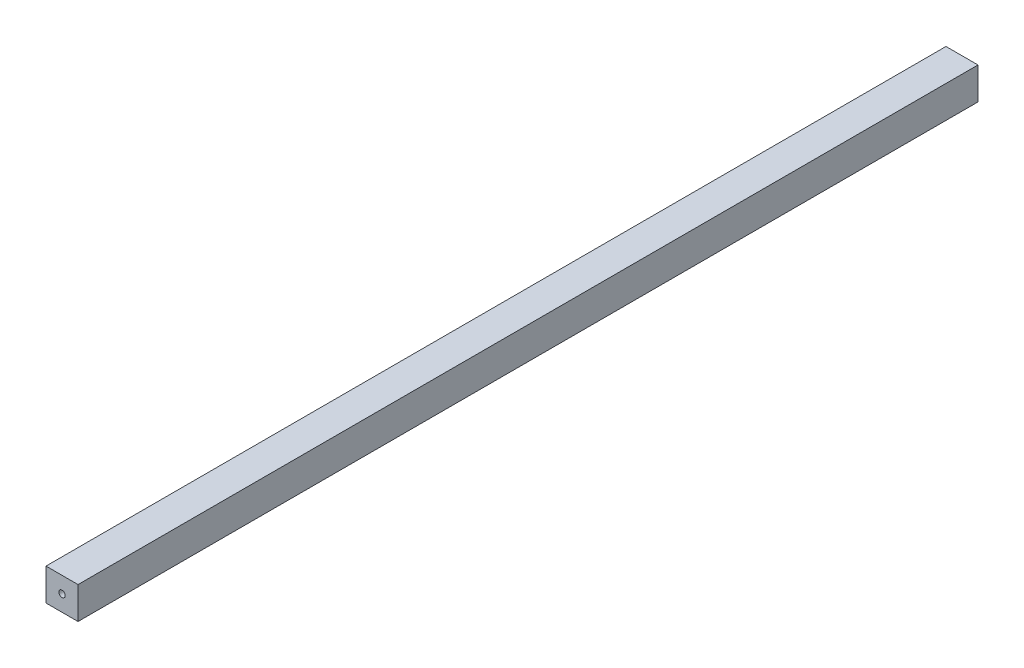
ISO-10303-21;
HEADER;
FILE_DESCRIPTION(('STEP AP214'),'2;1');
FILE_NAME('part.step','',(''),(''),'','','');
FILE_SCHEMA(('AUTOMOTIVE_DESIGN { 1 0 10303 214 1 1 1 1 }'));
ENDSEC;
DATA;
#1=APPLICATION_CONTEXT('core data for automotive mechanical design processes');
#2=APPLICATION_PROTOCOL_DEFINITION('international standard','automotive_design',2000,#1);
#3=PRODUCT_CONTEXT('',#1,'mechanical');
#4=PRODUCT('Part','Part','',(#3));
#5=PRODUCT_RELATED_PRODUCT_CATEGORY('part','',(#4));
#6=PRODUCT_DEFINITION_FORMATION('','',#4);
#7=PRODUCT_DEFINITION_CONTEXT('part definition',#1,'design');
#8=PRODUCT_DEFINITION('design','',#6,#7);
#9=PRODUCT_DEFINITION_SHAPE('','',#8);
#10=(LENGTH_UNIT() NAMED_UNIT(*) SI_UNIT(.MILLI.,.METRE.));
#11=(NAMED_UNIT(*) PLANE_ANGLE_UNIT() SI_UNIT($,.RADIAN.));
#12=(NAMED_UNIT(*) SI_UNIT($,.STERADIAN.) SOLID_ANGLE_UNIT());
#13=UNCERTAINTY_MEASURE_WITH_UNIT(LENGTH_MEASURE(1.E-05),#10,'distance_accuracy_value','');
#14=(GEOMETRIC_REPRESENTATION_CONTEXT(3) GLOBAL_UNCERTAINTY_ASSIGNED_CONTEXT((#13)) GLOBAL_UNIT_ASSIGNED_CONTEXT((#10,
#11,#12)) REPRESENTATION_CONTEXT('',''));
#15=CARTESIAN_POINT('',(0.,0.,0.));
#16=DIRECTION('',(0.,0.,1.));
#17=DIRECTION('',(1.,0.,0.));
#18=AXIS2_PLACEMENT_3D('',#15,#16,#17);
#19=CARTESIAN_POINT('',(0.,0.,562.));
#20=DIRECTION('',(1.,0.,0.));
#21=DIRECTION('',(0.,0.,-1.));
#22=AXIS2_PLACEMENT_3D('',#19,#20,#21);
#23=PLANE('',#22);
#24=CARTESIAN_POINT('',(0.,10.,551.));
#25=DIRECTION('',(-1.,0.,0.));
#26=DIRECTION('',(0.,0.,1.));
#27=AXIS2_PLACEMENT_3D('',#24,#25,#26);
#28=CIRCLE('',#27,1.49999999999999);
#29=CARTESIAN_POINT('',(0.,10.,552.5));
#30=VERTEX_POINT('',#29);
#31=EDGE_CURVE('E142',#30,#30,#28,.T.);
#32=ORIENTED_EDGE('',*,*,#31,.F.);
#33=EDGE_LOOP('',(#32));
#34=FACE_BOUND('',#33,.T.);
#35=CARTESIAN_POINT('',(0.,9.99999999999958,491.));
#36=DIRECTION('',(-1.,0.,0.));
#37=DIRECTION('',(0.,0.,1.));
#38=AXIS2_PLACEMENT_3D('',#35,#36,#37);
#39=CIRCLE('',#38,1.49999999999999);
#40=CARTESIAN_POINT('',(0.,9.99999999999958,492.5));
#41=VERTEX_POINT('',#40);
#42=EDGE_CURVE('E148',#41,#41,#39,.T.);
#43=ORIENTED_EDGE('',*,*,#42,.F.);
#44=EDGE_LOOP('',(#43));
#45=FACE_BOUND('',#44,.T.);
#46=CARTESIAN_POINT('',(0.,9.99999999999916,431.));
#47=DIRECTION('',(-1.,0.,0.));
#48=DIRECTION('',(0.,0.,1.));
#49=AXIS2_PLACEMENT_3D('',#46,#47,#48);
#50=CIRCLE('',#49,1.49999999999999);
#51=CARTESIAN_POINT('',(0.,9.99999999999916,432.5));
#52=VERTEX_POINT('',#51);
#53=EDGE_CURVE('E154',#52,#52,#50,.T.);
#54=ORIENTED_EDGE('',*,*,#53,.F.);
#55=EDGE_LOOP('',(#54));
#56=FACE_BOUND('',#55,.T.);
#57=CARTESIAN_POINT('',(0.,9.99999999999874,371.));
#58=DIRECTION('',(-1.,0.,0.));
#59=DIRECTION('',(0.,0.,1.));
#60=AXIS2_PLACEMENT_3D('',#57,#58,#59);
#61=CIRCLE('',#60,1.49999999999999);
#62=CARTESIAN_POINT('',(0.,9.99999999999874,372.5));
#63=VERTEX_POINT('',#62);
#64=EDGE_CURVE('E160',#63,#63,#61,.T.);
#65=ORIENTED_EDGE('',*,*,#64,.F.);
#66=EDGE_LOOP('',(#65));
#67=FACE_BOUND('',#66,.T.);
#68=CARTESIAN_POINT('',(0.,9.99999999999832,311.));
#69=DIRECTION('',(-1.,0.,0.));
#70=DIRECTION('',(0.,0.,1.));
#71=AXIS2_PLACEMENT_3D('',#68,#69,#70);
#72=CIRCLE('',#71,1.49999999999999);
#73=CARTESIAN_POINT('',(0.,9.99999999999832,312.5));
#74=VERTEX_POINT('',#73);
#75=EDGE_CURVE('E166',#74,#74,#72,.T.);
#76=ORIENTED_EDGE('',*,*,#75,.F.);
#77=EDGE_LOOP('',(#76));
#78=FACE_BOUND('',#77,.T.);
#79=CARTESIAN_POINT('',(0.,9.9999999999979,251.));
#80=DIRECTION('',(-1.,0.,0.));
#81=DIRECTION('',(0.,0.,1.));
#82=AXIS2_PLACEMENT_3D('',#79,#80,#81);
#83=CIRCLE('',#82,1.49999999999999);
#84=CARTESIAN_POINT('',(0.,9.9999999999979,252.5));
#85=VERTEX_POINT('',#84);
#86=EDGE_CURVE('E172',#85,#85,#83,.T.);
#87=ORIENTED_EDGE('',*,*,#86,.F.);
#88=EDGE_LOOP('',(#87));
#89=FACE_BOUND('',#88,.T.);
#90=CARTESIAN_POINT('',(0.,9.99999999999749,191.));
#91=DIRECTION('',(-1.,0.,0.));
#92=DIRECTION('',(0.,0.,1.));
#93=AXIS2_PLACEMENT_3D('',#90,#91,#92);
#94=CIRCLE('',#93,1.49999999999999);
#95=CARTESIAN_POINT('',(0.,9.99999999999749,192.5));
#96=VERTEX_POINT('',#95);
#97=EDGE_CURVE('E178',#96,#96,#94,.T.);
#98=ORIENTED_EDGE('',*,*,#97,.F.);
#99=EDGE_LOOP('',(#98));
#100=FACE_BOUND('',#99,.T.);
#101=CARTESIAN_POINT('',(0.,9.99999999999707,131.));
#102=DIRECTION('',(-1.,0.,0.));
#103=DIRECTION('',(0.,0.,1.));
#104=AXIS2_PLACEMENT_3D('',#101,#102,#103);
#105=CIRCLE('',#104,1.49999999999999);
#106=CARTESIAN_POINT('',(0.,9.99999999999707,132.5));
#107=VERTEX_POINT('',#106);
#108=EDGE_CURVE('E184',#107,#107,#105,.T.);
#109=ORIENTED_EDGE('',*,*,#108,.F.);
#110=EDGE_LOOP('',(#109));
#111=FACE_BOUND('',#110,.T.);
#112=CARTESIAN_POINT('',(0.,9.99999999999665,71.0000000000001));
#113=DIRECTION('',(-1.,0.,0.));
#114=DIRECTION('',(0.,0.,1.));
#115=AXIS2_PLACEMENT_3D('',#112,#113,#114);
#116=CIRCLE('',#115,1.49999999999999);
#117=CARTESIAN_POINT('',(0.,9.99999999999665,72.5000000000001));
#118=VERTEX_POINT('',#117);
#119=EDGE_CURVE('E190',#118,#118,#116,.T.);
#120=ORIENTED_EDGE('',*,*,#119,.F.);
#121=EDGE_LOOP('',(#120));
#122=FACE_BOUND('',#121,.T.);
#123=CARTESIAN_POINT('',(0.,9.99999999999623,11.));
#124=DIRECTION('',(-1.,0.,0.));
#125=DIRECTION('',(0.,0.,1.));
#126=AXIS2_PLACEMENT_3D('',#123,#124,#125);
#127=CIRCLE('',#126,1.49999999999999);
#128=CARTESIAN_POINT('',(0.,9.99999999999623,12.5));
#129=VERTEX_POINT('',#128);
#130=EDGE_CURVE('E196',#129,#129,#127,.T.);
#131=ORIENTED_EDGE('',*,*,#130,.F.);
#132=EDGE_LOOP('',(#131));
#133=FACE_BOUND('',#132,.T.);
#134=DIRECTION('',(0.,-1.,0.));
#135=VECTOR('',#134,1.);
#136=CARTESIAN_POINT('',(0.,0.,0.));
#137=LINE('',#136,#135);
#138=CARTESIAN_POINT('',(0.,20.,0.));
#139=VERTEX_POINT('',#138);
#140=CARTESIAN_POINT('',(0.,0.,0.));
#141=VERTEX_POINT('',#140);
#142=EDGE_CURVE('E202',#139,#141,#137,.T.);
#143=ORIENTED_EDGE('',*,*,#142,.T.);
#144=DIRECTION('',(0.,0.,-1.));
#145=VECTOR('',#144,1.);
#146=CARTESIAN_POINT('',(0.,0.,562.));
#147=LINE('',#146,#145);
#148=CARTESIAN_POINT('',(0.,0.,562.));
#149=VERTEX_POINT('',#148);
#150=EDGE_CURVE('E11',#149,#141,#147,.T.);
#151=ORIENTED_EDGE('',*,*,#150,.F.);
#152=DIRECTION('',(0.,-1.,0.));
#153=VECTOR('',#152,1.);
#154=CARTESIAN_POINT('',(0.,0.,562.));
#155=LINE('',#154,#153);
#156=CARTESIAN_POINT('',(0.,20.,562.));
#157=VERTEX_POINT('',#156);
#158=EDGE_CURVE('E203',#157,#149,#155,.T.);
#159=ORIENTED_EDGE('',*,*,#158,.F.);
#160=DIRECTION('',(0.,0.,-1.));
#161=VECTOR('',#160,1.);
#162=CARTESIAN_POINT('',(0.,20.,562.));
#163=LINE('',#162,#161);
#164=EDGE_CURVE('E209',#157,#139,#163,.T.);
#165=ORIENTED_EDGE('',*,*,#164,.T.);
#166=EDGE_LOOP('',(#143,#151,#159,#165));
#167=FACE_BOUND('',#166,.T.);
#168=ADVANCED_FACE('F37',(#34,#45,#56,#67,#78,#89,#100,#111,#122,#133,#167),#23,.F.);
#169=CARTESIAN_POINT('',(0.,0.,562.));
#170=DIRECTION('',(0.,1.,0.));
#171=DIRECTION('',(0.,0.,1.));
#172=AXIS2_PLACEMENT_3D('',#169,#170,#171);
#173=PLANE('',#172);
#174=DIRECTION('',(1.,0.,0.));
#175=VECTOR('',#174,1.);
#176=CARTESIAN_POINT('',(0.,0.,0.));
#177=LINE('',#176,#175);
#178=CARTESIAN_POINT('',(20.,0.,0.));
#179=VERTEX_POINT('',#178);
#180=EDGE_CURVE('E212',#141,#179,#177,.T.);
#181=ORIENTED_EDGE('',*,*,#180,.T.);
#182=DIRECTION('',(0.,0.,-1.));
#183=VECTOR('',#182,1.);
#184=CARTESIAN_POINT('',(20.,0.,562.));
#185=LINE('',#184,#183);
#186=CARTESIAN_POINT('',(20.,0.,562.));
#187=VERTEX_POINT('',#186);
#188=EDGE_CURVE('E45',#187,#179,#185,.T.);
#189=ORIENTED_EDGE('',*,*,#188,.F.);
#190=DIRECTION('',(1.,0.,0.));
#191=VECTOR('',#190,1.);
#192=CARTESIAN_POINT('',(0.,0.,562.));
#193=LINE('',#192,#191);
#194=EDGE_CURVE('E84',#149,#187,#193,.T.);
#195=ORIENTED_EDGE('',*,*,#194,.F.);
#196=ORIENTED_EDGE('',*,*,#150,.T.);
#197=EDGE_LOOP('',(#181,#189,#195,#196));
#198=FACE_BOUND('',#197,.T.);
#199=ADVANCED_FACE('F236',(#198),#173,.F.);
#200=CARTESIAN_POINT('',(20.,0.,562.));
#201=DIRECTION('',(-1.,0.,0.));
#202=DIRECTION('',(0.,0.,1.));
#203=AXIS2_PLACEMENT_3D('',#200,#201,#202);
#204=PLANE('',#203);
#205=DIRECTION('',(0.,1.,0.));
#206=VECTOR('',#205,1.);
#207=CARTESIAN_POINT('',(20.,0.,0.));
#208=LINE('',#207,#206);
#209=CARTESIAN_POINT('',(20.,20.,0.));
#210=VERTEX_POINT('',#209);
#211=EDGE_CURVE('E71',#179,#210,#208,.T.);
#212=ORIENTED_EDGE('',*,*,#211,.T.);
#213=DIRECTION('',(0.,0.,-1.));
#214=VECTOR('',#213,1.);
#215=CARTESIAN_POINT('',(20.,20.,562.));
#216=LINE('',#215,#214);
#217=CARTESIAN_POINT('',(20.,20.,562.));
#218=VERTEX_POINT('',#217);
#219=EDGE_CURVE('E217',#218,#210,#216,.T.);
#220=ORIENTED_EDGE('',*,*,#219,.F.);
#221=DIRECTION('',(0.,1.,0.));
#222=VECTOR('',#221,1.);
#223=CARTESIAN_POINT('',(20.,0.,562.));
#224=LINE('',#223,#222);
#225=EDGE_CURVE('E206',#187,#218,#224,.T.);
#226=ORIENTED_EDGE('',*,*,#225,.F.);
#227=ORIENTED_EDGE('',*,*,#188,.T.);
#228=EDGE_LOOP('',(#212,#220,#226,#227));
#229=FACE_BOUND('',#228,.T.);
#230=ADVANCED_FACE('F219',(#229),#204,.F.);
#231=CARTESIAN_POINT('',(0.,20.,562.));
#232=DIRECTION('',(0.,-1.,0.));
#233=DIRECTION('',(0.,0.,-1.));
#234=AXIS2_PLACEMENT_3D('',#231,#232,#233);
#235=PLANE('',#234);
#236=DIRECTION('',(-1.,0.,0.));
#237=VECTOR('',#236,1.);
#238=CARTESIAN_POINT('',(0.,20.,0.));
#239=LINE('',#238,#237);
#240=EDGE_CURVE('E77',#210,#139,#239,.T.);
#241=ORIENTED_EDGE('',*,*,#240,.T.);
#242=ORIENTED_EDGE('',*,*,#164,.F.);
#243=DIRECTION('',(-1.,0.,0.));
#244=VECTOR('',#243,1.);
#245=CARTESIAN_POINT('',(0.,20.,562.));
#246=LINE('',#245,#244);
#247=EDGE_CURVE('E53',#218,#157,#246,.T.);
#248=ORIENTED_EDGE('',*,*,#247,.F.);
#249=ORIENTED_EDGE('',*,*,#219,.T.);
#250=EDGE_LOOP('',(#241,#242,#248,#249));
#251=FACE_BOUND('',#250,.T.);
#252=ADVANCED_FACE('F226',(#251),#235,.F.);
#253=CARTESIAN_POINT('',(0.,0.,562.));
#254=DIRECTION('',(0.,0.,-1.));
#255=DIRECTION('',(-1.,0.,0.));
#256=AXIS2_PLACEMENT_3D('',#253,#254,#255);
#257=PLANE('',#256);
#258=CARTESIAN_POINT('',(10.,10.,562.));
#259=DIRECTION('',(0.,0.,1.));
#260=DIRECTION('',(1.,0.,0.));
#261=AXIS2_PLACEMENT_3D('',#258,#259,#260);
#262=CIRCLE('',#261,1.99999999999999);
#263=CARTESIAN_POINT('',(12.,10.,562.));
#264=VERTEX_POINT('',#263);
#265=EDGE_CURVE('E131',#264,#264,#262,.T.);
#266=ORIENTED_EDGE('',*,*,#265,.F.);
#267=EDGE_LOOP('',(#266));
#268=FACE_BOUND('',#267,.T.);
#269=ORIENTED_EDGE('',*,*,#158,.T.);
#270=ORIENTED_EDGE('',*,*,#194,.T.);
#271=ORIENTED_EDGE('',*,*,#225,.T.);
#272=ORIENTED_EDGE('',*,*,#247,.T.);
#273=EDGE_LOOP('',(#269,#270,#271,#272));
#274=FACE_BOUND('',#273,.T.);
#275=ADVANCED_FACE('F228',(#268,#274),#257,.F.);
#276=CARTESIAN_POINT('',(0.,0.,0.));
#277=DIRECTION('',(0.,0.,-1.));
#278=DIRECTION('',(-1.,0.,0.));
#279=AXIS2_PLACEMENT_3D('',#276,#277,#278);
#280=PLANE('',#279);
#281=CARTESIAN_POINT('',(10.,10.,0.));
#282=DIRECTION('',(0.,0.,-1.));
#283=DIRECTION('',(-1.,0.,0.));
#284=AXIS2_PLACEMENT_3D('',#281,#282,#283);
#285=CIRCLE('',#284,1.99999999999999);
#286=CARTESIAN_POINT('',(8.00000000000001,10.,0.));
#287=VERTEX_POINT('',#286);
#288=EDGE_CURVE('E132',#287,#287,#285,.T.);
#289=ORIENTED_EDGE('',*,*,#288,.F.);
#290=EDGE_LOOP('',(#289));
#291=FACE_BOUND('',#290,.T.);
#292=ORIENTED_EDGE('',*,*,#142,.F.);
#293=ORIENTED_EDGE('',*,*,#240,.F.);
#294=ORIENTED_EDGE('',*,*,#211,.F.);
#295=ORIENTED_EDGE('',*,*,#180,.F.);
#296=EDGE_LOOP('',(#292,#293,#294,#295));
#297=FACE_BOUND('',#296,.T.);
#298=ADVANCED_FACE('F222',(#291,#297),#280,.T.);
#299=CARTESIAN_POINT('',(8.,9.99999999999623,11.));
#300=DIRECTION('',(-1.,0.,0.));
#301=DIRECTION('',(0.,0.,1.));
#302=AXIS2_PLACEMENT_3D('',#299,#300,#301);
#303=CONICAL_SURFACE('',#302,1.5,1.02974425867665);
#304=CARTESIAN_POINT('',(8.90129092854134,9.99999999999623,11.));
#305=VERTEX_POINT('',#304);
#306=VERTEX_LOOP('',#305);
#307=FACE_BOUND('',#306,.T.);
#308=CARTESIAN_POINT('',(8.,9.99999999999623,11.));
#309=DIRECTION('',(-1.,0.,0.));
#310=DIRECTION('',(0.,0.,1.));
#311=AXIS2_PLACEMENT_3D('',#308,#309,#310);
#312=CIRCLE('',#311,1.5);
#313=CARTESIAN_POINT('',(8.,9.99999999999623,12.5));
#314=VERTEX_POINT('',#313);
#315=EDGE_CURVE('E199',#314,#314,#312,.T.);
#316=ORIENTED_EDGE('',*,*,#315,.T.);
#317=EDGE_LOOP('',(#316));
#318=FACE_BOUND('',#317,.T.);
#319=ADVANCED_FACE('F267',(#307,#318),#303,.F.);
#320=CARTESIAN_POINT('',(0.,9.99999999999623,11.));
#321=DIRECTION('',(-1.,0.,0.));
#322=DIRECTION('',(0.,0.,1.));
#323=AXIS2_PLACEMENT_3D('',#320,#321,#322);
#324=CYLINDRICAL_SURFACE('',#323,1.49999999999999);
#325=ORIENTED_EDGE('',*,*,#315,.F.);
#326=EDGE_LOOP('',(#325));
#327=FACE_BOUND('',#326,.T.);
#328=ORIENTED_EDGE('',*,*,#130,.T.);
#329=EDGE_LOOP('',(#328));
#330=FACE_BOUND('',#329,.T.);
#331=ADVANCED_FACE('F264',(#327,#330),#324,.F.);
#332=CARTESIAN_POINT('',(8.,9.99999999999665,71.0000000000001));
#333=DIRECTION('',(-1.,0.,0.));
#334=DIRECTION('',(0.,0.,1.));
#335=AXIS2_PLACEMENT_3D('',#332,#333,#334);
#336=CONICAL_SURFACE('',#335,1.5,1.02974425867665);
#337=CARTESIAN_POINT('',(8.90129092854134,9.99999999999665,71.0000000000001));
#338=VERTEX_POINT('',#337);
#339=VERTEX_LOOP('',#338);
#340=FACE_BOUND('',#339,.T.);
#341=CARTESIAN_POINT('',(8.,9.99999999999665,71.0000000000001));
#342=DIRECTION('',(-1.,0.,0.));
#343=DIRECTION('',(0.,0.,1.));
#344=AXIS2_PLACEMENT_3D('',#341,#342,#343);
#345=CIRCLE('',#344,1.5);
#346=CARTESIAN_POINT('',(8.,9.99999999999665,72.5000000000001));
#347=VERTEX_POINT('',#346);
#348=EDGE_CURVE('E193',#347,#347,#345,.T.);
#349=ORIENTED_EDGE('',*,*,#348,.T.);
#350=EDGE_LOOP('',(#349));
#351=FACE_BOUND('',#350,.T.);
#352=ADVANCED_FACE('F266',(#340,#351),#336,.F.);
#353=CARTESIAN_POINT('',(0.,9.99999999999665,71.0000000000001));
#354=DIRECTION('',(-1.,0.,0.));
#355=DIRECTION('',(0.,0.,1.));
#356=AXIS2_PLACEMENT_3D('',#353,#354,#355);
#357=CYLINDRICAL_SURFACE('',#356,1.49999999999999);
#358=ORIENTED_EDGE('',*,*,#348,.F.);
#359=EDGE_LOOP('',(#358));
#360=FACE_BOUND('',#359,.T.);
#361=ORIENTED_EDGE('',*,*,#119,.T.);
#362=EDGE_LOOP('',(#361));
#363=FACE_BOUND('',#362,.T.);
#364=ADVANCED_FACE('F274',(#360,#363),#357,.F.);
#365=CARTESIAN_POINT('',(8.,9.99999999999707,131.));
#366=DIRECTION('',(-1.,0.,0.));
#367=DIRECTION('',(0.,0.,1.));
#368=AXIS2_PLACEMENT_3D('',#365,#366,#367);
#369=CONICAL_SURFACE('',#368,1.5,1.02974425867665);
#370=CARTESIAN_POINT('',(8.90129092854134,9.99999999999707,131.));
#371=VERTEX_POINT('',#370);
#372=VERTEX_LOOP('',#371);
#373=FACE_BOUND('',#372,.T.);
#374=CARTESIAN_POINT('',(8.,9.99999999999707,131.));
#375=DIRECTION('',(-1.,0.,0.));
#376=DIRECTION('',(0.,0.,1.));
#377=AXIS2_PLACEMENT_3D('',#374,#375,#376);
#378=CIRCLE('',#377,1.5);
#379=CARTESIAN_POINT('',(8.,9.99999999999707,132.5));
#380=VERTEX_POINT('',#379);
#381=EDGE_CURVE('E187',#380,#380,#378,.T.);
#382=ORIENTED_EDGE('',*,*,#381,.T.);
#383=EDGE_LOOP('',(#382));
#384=FACE_BOUND('',#383,.T.);
#385=ADVANCED_FACE('F358',(#373,#384),#369,.F.);
#386=CARTESIAN_POINT('',(0.,9.99999999999707,131.));
#387=DIRECTION('',(-1.,0.,0.));
#388=DIRECTION('',(0.,0.,1.));
#389=AXIS2_PLACEMENT_3D('',#386,#387,#388);
#390=CYLINDRICAL_SURFACE('',#389,1.49999999999999);
#391=ORIENTED_EDGE('',*,*,#381,.F.);
#392=EDGE_LOOP('',(#391));
#393=FACE_BOUND('',#392,.T.);
#394=ORIENTED_EDGE('',*,*,#108,.T.);
#395=EDGE_LOOP('',(#394));
#396=FACE_BOUND('',#395,.T.);
#397=ADVANCED_FACE('F354',(#393,#396),#390,.F.);
#398=CARTESIAN_POINT('',(8.,9.99999999999749,191.));
#399=DIRECTION('',(-1.,0.,0.));
#400=DIRECTION('',(0.,0.,1.));
#401=AXIS2_PLACEMENT_3D('',#398,#399,#400);
#402=CONICAL_SURFACE('',#401,1.5,1.02974425867665);
#403=CARTESIAN_POINT('',(8.90129092854134,9.99999999999748,191.));
#404=VERTEX_POINT('',#403);
#405=VERTEX_LOOP('',#404);
#406=FACE_BOUND('',#405,.T.);
#407=CARTESIAN_POINT('',(8.,9.99999999999749,191.));
#408=DIRECTION('',(-1.,0.,0.));
#409=DIRECTION('',(0.,0.,1.));
#410=AXIS2_PLACEMENT_3D('',#407,#408,#409);
#411=CIRCLE('',#410,1.5);
#412=CARTESIAN_POINT('',(8.,9.99999999999749,192.5));
#413=VERTEX_POINT('',#412);
#414=EDGE_CURVE('E181',#413,#413,#411,.T.);
#415=ORIENTED_EDGE('',*,*,#414,.T.);
#416=EDGE_LOOP('',(#415));
#417=FACE_BOUND('',#416,.T.);
#418=ADVANCED_FACE('F350',(#406,#417),#402,.F.);
#419=CARTESIAN_POINT('',(0.,9.99999999999749,191.));
#420=DIRECTION('',(-1.,0.,0.));
#421=DIRECTION('',(0.,0.,1.));
#422=AXIS2_PLACEMENT_3D('',#419,#420,#421);
#423=CYLINDRICAL_SURFACE('',#422,1.49999999999999);
#424=ORIENTED_EDGE('',*,*,#414,.F.);
#425=EDGE_LOOP('',(#424));
#426=FACE_BOUND('',#425,.T.);
#427=ORIENTED_EDGE('',*,*,#97,.T.);
#428=EDGE_LOOP('',(#427));
#429=FACE_BOUND('',#428,.T.);
#430=ADVANCED_FACE('F346',(#426,#429),#423,.F.);
#431=CARTESIAN_POINT('',(8.,9.9999999999979,251.));
#432=DIRECTION('',(-1.,0.,0.));
#433=DIRECTION('',(0.,0.,1.));
#434=AXIS2_PLACEMENT_3D('',#431,#432,#433);
#435=CONICAL_SURFACE('',#434,1.5,1.02974425867665);
#436=CARTESIAN_POINT('',(8.90129092854134,9.9999999999979,251.));
#437=VERTEX_POINT('',#436);
#438=VERTEX_LOOP('',#437);
#439=FACE_BOUND('',#438,.T.);
#440=CARTESIAN_POINT('',(8.,9.9999999999979,251.));
#441=DIRECTION('',(-1.,0.,0.));
#442=DIRECTION('',(0.,0.,1.));
#443=AXIS2_PLACEMENT_3D('',#440,#441,#442);
#444=CIRCLE('',#443,1.5);
#445=CARTESIAN_POINT('',(8.,9.9999999999979,252.5));
#446=VERTEX_POINT('',#445);
#447=EDGE_CURVE('E175',#446,#446,#444,.T.);
#448=ORIENTED_EDGE('',*,*,#447,.T.);
#449=EDGE_LOOP('',(#448));
#450=FACE_BOUND('',#449,.T.);
#451=ADVANCED_FACE('F342',(#439,#450),#435,.F.);
#452=CARTESIAN_POINT('',(0.,9.9999999999979,251.));
#453=DIRECTION('',(-1.,0.,0.));
#454=DIRECTION('',(0.,0.,1.));
#455=AXIS2_PLACEMENT_3D('',#452,#453,#454);
#456=CYLINDRICAL_SURFACE('',#455,1.49999999999999);
#457=ORIENTED_EDGE('',*,*,#447,.F.);
#458=EDGE_LOOP('',(#457));
#459=FACE_BOUND('',#458,.T.);
#460=ORIENTED_EDGE('',*,*,#86,.T.);
#461=EDGE_LOOP('',(#460));
#462=FACE_BOUND('',#461,.T.);
#463=ADVANCED_FACE('F338',(#459,#462),#456,.F.);
#464=CARTESIAN_POINT('',(8.,9.99999999999832,311.));
#465=DIRECTION('',(-1.,0.,0.));
#466=DIRECTION('',(0.,0.,1.));
#467=AXIS2_PLACEMENT_3D('',#464,#465,#466);
#468=CONICAL_SURFACE('',#467,1.5,1.02974425867665);
#469=CARTESIAN_POINT('',(8.90129092854134,9.99999999999832,311.));
#470=VERTEX_POINT('',#469);
#471=VERTEX_LOOP('',#470);
#472=FACE_BOUND('',#471,.T.);
#473=CARTESIAN_POINT('',(8.,9.99999999999832,311.));
#474=DIRECTION('',(-1.,0.,0.));
#475=DIRECTION('',(0.,0.,1.));
#476=AXIS2_PLACEMENT_3D('',#473,#474,#475);
#477=CIRCLE('',#476,1.5);
#478=CARTESIAN_POINT('',(8.,9.99999999999832,312.5));
#479=VERTEX_POINT('',#478);
#480=EDGE_CURVE('E169',#479,#479,#477,.T.);
#481=ORIENTED_EDGE('',*,*,#480,.T.);
#482=EDGE_LOOP('',(#481));
#483=FACE_BOUND('',#482,.T.);
#484=ADVANCED_FACE('F334',(#472,#483),#468,.F.);
#485=CARTESIAN_POINT('',(0.,9.99999999999832,311.));
#486=DIRECTION('',(-1.,0.,0.));
#487=DIRECTION('',(0.,0.,1.));
#488=AXIS2_PLACEMENT_3D('',#485,#486,#487);
#489=CYLINDRICAL_SURFACE('',#488,1.49999999999999);
#490=ORIENTED_EDGE('',*,*,#480,.F.);
#491=EDGE_LOOP('',(#490));
#492=FACE_BOUND('',#491,.T.);
#493=ORIENTED_EDGE('',*,*,#75,.T.);
#494=EDGE_LOOP('',(#493));
#495=FACE_BOUND('',#494,.T.);
#496=ADVANCED_FACE('F330',(#492,#495),#489,.F.);
#497=CARTESIAN_POINT('',(8.,9.99999999999874,371.));
#498=DIRECTION('',(-1.,0.,0.));
#499=DIRECTION('',(0.,0.,1.));
#500=AXIS2_PLACEMENT_3D('',#497,#498,#499);
#501=CONICAL_SURFACE('',#500,1.5,1.02974425867665);
#502=CARTESIAN_POINT('',(8.90129092854134,9.99999999999874,371.));
#503=VERTEX_POINT('',#502);
#504=VERTEX_LOOP('',#503);
#505=FACE_BOUND('',#504,.T.);
#506=CARTESIAN_POINT('',(8.,9.99999999999874,371.));
#507=DIRECTION('',(-1.,0.,0.));
#508=DIRECTION('',(0.,0.,1.));
#509=AXIS2_PLACEMENT_3D('',#506,#507,#508);
#510=CIRCLE('',#509,1.5);
#511=CARTESIAN_POINT('',(8.,9.99999999999874,372.5));
#512=VERTEX_POINT('',#511);
#513=EDGE_CURVE('E163',#512,#512,#510,.T.);
#514=ORIENTED_EDGE('',*,*,#513,.T.);
#515=EDGE_LOOP('',(#514));
#516=FACE_BOUND('',#515,.T.);
#517=ADVANCED_FACE('F326',(#505,#516),#501,.F.);
#518=CARTESIAN_POINT('',(0.,9.99999999999874,371.));
#519=DIRECTION('',(-1.,0.,0.));
#520=DIRECTION('',(0.,0.,1.));
#521=AXIS2_PLACEMENT_3D('',#518,#519,#520);
#522=CYLINDRICAL_SURFACE('',#521,1.49999999999999);
#523=ORIENTED_EDGE('',*,*,#513,.F.);
#524=EDGE_LOOP('',(#523));
#525=FACE_BOUND('',#524,.T.);
#526=ORIENTED_EDGE('',*,*,#64,.T.);
#527=EDGE_LOOP('',(#526));
#528=FACE_BOUND('',#527,.T.);
#529=ADVANCED_FACE('F322',(#525,#528),#522,.F.);
#530=CARTESIAN_POINT('',(8.,9.99999999999916,431.));
#531=DIRECTION('',(-1.,0.,0.));
#532=DIRECTION('',(0.,0.,1.));
#533=AXIS2_PLACEMENT_3D('',#530,#531,#532);
#534=CONICAL_SURFACE('',#533,1.5,1.02974425867665);
#535=CARTESIAN_POINT('',(8.90129092854134,9.99999999999916,431.));
#536=VERTEX_POINT('',#535);
#537=VERTEX_LOOP('',#536);
#538=FACE_BOUND('',#537,.T.);
#539=CARTESIAN_POINT('',(8.,9.99999999999916,431.));
#540=DIRECTION('',(-1.,0.,0.));
#541=DIRECTION('',(0.,0.,1.));
#542=AXIS2_PLACEMENT_3D('',#539,#540,#541);
#543=CIRCLE('',#542,1.5);
#544=CARTESIAN_POINT('',(8.,9.99999999999916,432.5));
#545=VERTEX_POINT('',#544);
#546=EDGE_CURVE('E157',#545,#545,#543,.T.);
#547=ORIENTED_EDGE('',*,*,#546,.T.);
#548=EDGE_LOOP('',(#547));
#549=FACE_BOUND('',#548,.T.);
#550=ADVANCED_FACE('F318',(#538,#549),#534,.F.);
#551=CARTESIAN_POINT('',(0.,9.99999999999916,431.));
#552=DIRECTION('',(-1.,0.,0.));
#553=DIRECTION('',(0.,0.,1.));
#554=AXIS2_PLACEMENT_3D('',#551,#552,#553);
#555=CYLINDRICAL_SURFACE('',#554,1.49999999999999);
#556=ORIENTED_EDGE('',*,*,#546,.F.);
#557=EDGE_LOOP('',(#556));
#558=FACE_BOUND('',#557,.T.);
#559=ORIENTED_EDGE('',*,*,#53,.T.);
#560=EDGE_LOOP('',(#559));
#561=FACE_BOUND('',#560,.T.);
#562=ADVANCED_FACE('F314',(#558,#561),#555,.F.);
#563=CARTESIAN_POINT('',(8.,9.99999999999958,491.));
#564=DIRECTION('',(-1.,0.,0.));
#565=DIRECTION('',(0.,0.,1.));
#566=AXIS2_PLACEMENT_3D('',#563,#564,#565);
#567=CONICAL_SURFACE('',#566,1.5,1.02974425867665);
#568=CARTESIAN_POINT('',(8.90129092854134,9.99999999999958,491.));
#569=VERTEX_POINT('',#568);
#570=VERTEX_LOOP('',#569);
#571=FACE_BOUND('',#570,.T.);
#572=CARTESIAN_POINT('',(8.,9.99999999999958,491.));
#573=DIRECTION('',(-1.,0.,0.));
#574=DIRECTION('',(0.,0.,1.));
#575=AXIS2_PLACEMENT_3D('',#572,#573,#574);
#576=CIRCLE('',#575,1.5);
#577=CARTESIAN_POINT('',(8.,9.99999999999958,492.5));
#578=VERTEX_POINT('',#577);
#579=EDGE_CURVE('E151',#578,#578,#576,.T.);
#580=ORIENTED_EDGE('',*,*,#579,.T.);
#581=EDGE_LOOP('',(#580));
#582=FACE_BOUND('',#581,.T.);
#583=ADVANCED_FACE('F310',(#571,#582),#567,.F.);
#584=CARTESIAN_POINT('',(0.,9.99999999999958,491.));
#585=DIRECTION('',(-1.,0.,0.));
#586=DIRECTION('',(0.,0.,1.));
#587=AXIS2_PLACEMENT_3D('',#584,#585,#586);
#588=CYLINDRICAL_SURFACE('',#587,1.49999999999999);
#589=ORIENTED_EDGE('',*,*,#579,.F.);
#590=EDGE_LOOP('',(#589));
#591=FACE_BOUND('',#590,.T.);
#592=ORIENTED_EDGE('',*,*,#42,.T.);
#593=EDGE_LOOP('',(#592));
#594=FACE_BOUND('',#593,.T.);
#595=ADVANCED_FACE('F306',(#591,#594),#588,.F.);
#596=CARTESIAN_POINT('',(8.,10.,551.));
#597=DIRECTION('',(-1.,0.,0.));
#598=DIRECTION('',(0.,0.,1.));
#599=AXIS2_PLACEMENT_3D('',#596,#597,#598);
#600=CONICAL_SURFACE('',#599,1.5,1.02974425867665);
#601=CARTESIAN_POINT('',(8.90129092854134,10.,551.));
#602=VERTEX_POINT('',#601);
#603=VERTEX_LOOP('',#602);
#604=FACE_BOUND('',#603,.T.);
#605=CARTESIAN_POINT('',(8.,10.,551.));
#606=DIRECTION('',(-1.,0.,0.));
#607=DIRECTION('',(0.,0.,1.));
#608=AXIS2_PLACEMENT_3D('',#605,#606,#607);
#609=CIRCLE('',#608,1.5);
#610=CARTESIAN_POINT('',(8.,10.,552.5));
#611=VERTEX_POINT('',#610);
#612=EDGE_CURVE('E145',#611,#611,#609,.T.);
#613=ORIENTED_EDGE('',*,*,#612,.T.);
#614=EDGE_LOOP('',(#613));
#615=FACE_BOUND('',#614,.T.);
#616=ADVANCED_FACE('F302',(#604,#615),#600,.F.);
#617=CARTESIAN_POINT('',(0.,10.,551.));
#618=DIRECTION('',(-1.,0.,0.));
#619=DIRECTION('',(0.,0.,1.));
#620=AXIS2_PLACEMENT_3D('',#617,#618,#619);
#621=CYLINDRICAL_SURFACE('',#620,1.49999999999999);
#622=ORIENTED_EDGE('',*,*,#612,.F.);
#623=EDGE_LOOP('',(#622));
#624=FACE_BOUND('',#623,.T.);
#625=ORIENTED_EDGE('',*,*,#31,.T.);
#626=EDGE_LOOP('',(#625));
#627=FACE_BOUND('',#626,.T.);
#628=ADVANCED_FACE('F298',(#624,#627),#621,.F.);
#629=CARTESIAN_POINT('',(10.,10.,556.));
#630=DIRECTION('',(0.,0.,1.));
#631=DIRECTION('',(1.,0.,0.));
#632=AXIS2_PLACEMENT_3D('',#629,#630,#631);
#633=CONICAL_SURFACE('',#632,2.,1.02974425867667);
#634=CARTESIAN_POINT('',(10.,10.,554.798278761945));
#635=VERTEX_POINT('',#634);
#636=VERTEX_LOOP('',#635);
#637=FACE_BOUND('',#636,.T.);
#638=CARTESIAN_POINT('',(10.,10.,556.));
#639=DIRECTION('',(0.,0.,1.));
#640=DIRECTION('',(1.,0.,0.));
#641=AXIS2_PLACEMENT_3D('',#638,#639,#640);
#642=CIRCLE('',#641,2.);
#643=CARTESIAN_POINT('',(12.,10.,556.));
#644=VERTEX_POINT('',#643);
#645=EDGE_CURVE('E135',#644,#644,#642,.T.);
#646=ORIENTED_EDGE('',*,*,#645,.T.);
#647=EDGE_LOOP('',(#646));
#648=FACE_BOUND('',#647,.T.);
#649=ADVANCED_FACE('F294',(#637,#648),#633,.F.);
#650=CARTESIAN_POINT('',(10.,10.,562.));
#651=DIRECTION('',(0.,0.,1.));
#652=DIRECTION('',(1.,0.,0.));
#653=AXIS2_PLACEMENT_3D('',#650,#651,#652);
#654=CYLINDRICAL_SURFACE('',#653,1.99999999999999);
#655=ORIENTED_EDGE('',*,*,#645,.F.);
#656=EDGE_LOOP('',(#655));
#657=FACE_BOUND('',#656,.T.);
#658=ORIENTED_EDGE('',*,*,#265,.T.);
#659=EDGE_LOOP('',(#658));
#660=FACE_BOUND('',#659,.T.);
#661=ADVANCED_FACE('F125',(#657,#660),#654,.F.);
#662=CARTESIAN_POINT('',(10.,10.,6.));
#663=DIRECTION('',(0.,0.,-1.));
#664=DIRECTION('',(-1.,0.,0.));
#665=AXIS2_PLACEMENT_3D('',#662,#663,#664);
#666=CONICAL_SURFACE('',#665,2.,1.02974425867665);
#667=CARTESIAN_POINT('',(10.,10.,7.20172123805512));
#668=VERTEX_POINT('',#667);
#669=VERTEX_LOOP('',#668);
#670=FACE_BOUND('',#669,.T.);
#671=CARTESIAN_POINT('',(10.,10.,6.));
#672=DIRECTION('',(0.,0.,-1.));
#673=DIRECTION('',(-1.,0.,0.));
#674=AXIS2_PLACEMENT_3D('',#671,#672,#673);
#675=CIRCLE('',#674,2.);
#676=CARTESIAN_POINT('',(8.,10.,6.));
#677=VERTEX_POINT('',#676);
#678=EDGE_CURVE('E129',#677,#677,#675,.T.);
#679=ORIENTED_EDGE('',*,*,#678,.T.);
#680=EDGE_LOOP('',(#679));
#681=FACE_BOUND('',#680,.T.);
#682=ADVANCED_FACE('F121',(#670,#681),#666,.F.);
#683=CARTESIAN_POINT('',(10.,10.,0.));
#684=DIRECTION('',(0.,0.,-1.));
#685=DIRECTION('',(-1.,0.,0.));
#686=AXIS2_PLACEMENT_3D('',#683,#684,#685);
#687=CYLINDRICAL_SURFACE('',#686,1.99999999999999);
#688=ORIENTED_EDGE('',*,*,#678,.F.);
#689=EDGE_LOOP('',(#688));
#690=FACE_BOUND('',#689,.T.);
#691=ORIENTED_EDGE('',*,*,#288,.T.);
#692=EDGE_LOOP('',(#691));
#693=FACE_BOUND('',#692,.T.);
#694=ADVANCED_FACE('F124',(#690,#693),#687,.F.);
#695=CLOSED_SHELL('',(#168,#199,#230,#252,#275,#298,#319,#331,#352,#364,#385,#397,#418,#430,
#451,#463,#484,#496,#517,#529,#550,#562,#583,#595,#616,#628,#649,#661,#682,#694));
#696=MANIFOLD_SOLID_BREP('B2',#695);
#697=ADVANCED_BREP_SHAPE_REPRESENTATION('',(#18,#696),#14);
#698=SHAPE_DEFINITION_REPRESENTATION(#9,#697);
ENDSEC;
END-ISO-10303-21;
